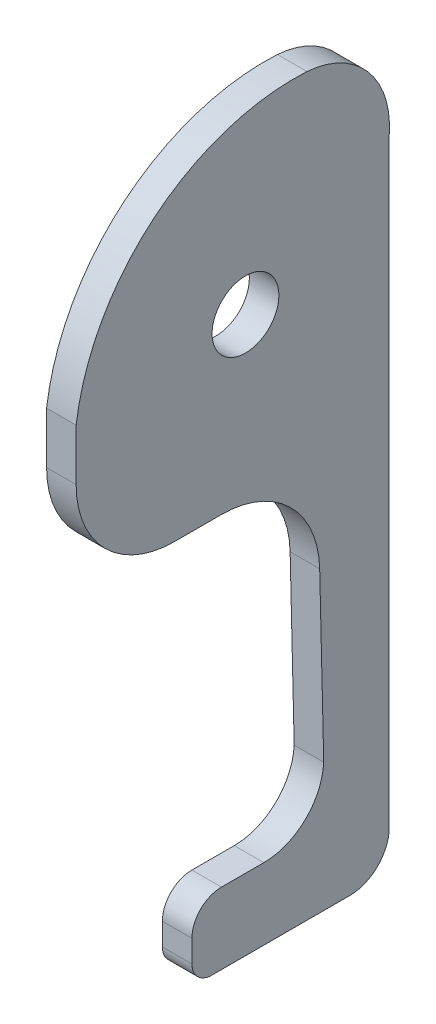
ISO-10303-21;
HEADER;
FILE_DESCRIPTION(('STEP AP214'),'2;1');
FILE_NAME('part.step','',(''),(''),'','','');
FILE_SCHEMA(('AUTOMOTIVE_DESIGN { 1 0 10303 214 1 1 1 1 }'));
ENDSEC;
DATA;
#1=APPLICATION_CONTEXT('core data for automotive mechanical design processes');
#2=APPLICATION_PROTOCOL_DEFINITION('international standard','automotive_design',2000,#1);
#3=PRODUCT_CONTEXT('',#1,'mechanical');
#4=PRODUCT('Part','Part','',(#3));
#5=PRODUCT_RELATED_PRODUCT_CATEGORY('part','',(#4));
#6=PRODUCT_DEFINITION_FORMATION('','',#4);
#7=PRODUCT_DEFINITION_CONTEXT('part definition',#1,'design');
#8=PRODUCT_DEFINITION('design','',#6,#7);
#9=PRODUCT_DEFINITION_SHAPE('','',#8);
#10=(LENGTH_UNIT() NAMED_UNIT(*) SI_UNIT(.MILLI.,.METRE.));
#11=(NAMED_UNIT(*) PLANE_ANGLE_UNIT() SI_UNIT($,.RADIAN.));
#12=(NAMED_UNIT(*) SI_UNIT($,.STERADIAN.) SOLID_ANGLE_UNIT());
#13=UNCERTAINTY_MEASURE_WITH_UNIT(LENGTH_MEASURE(1.E-05),#10,'distance_accuracy_value','');
#14=(GEOMETRIC_REPRESENTATION_CONTEXT(3) GLOBAL_UNCERTAINTY_ASSIGNED_CONTEXT((#13)) GLOBAL_UNIT_ASSIGNED_CONTEXT((#10,
#11,#12)) REPRESENTATION_CONTEXT('',''));
#15=CARTESIAN_POINT('',(0.,0.,0.));
#16=DIRECTION('',(0.,0.,1.));
#17=DIRECTION('',(1.,0.,0.));
#18=AXIS2_PLACEMENT_3D('',#15,#16,#17);
#19=CARTESIAN_POINT('',(8.6051080575,-142.638124585522,-103.998404298556));
#20=DIRECTION('',(-1.,0.,0.));
#21=DIRECTION('',(0.,0.,1.));
#22=AXIS2_PLACEMENT_3D('',#19,#20,#21);
#23=CYLINDRICAL_SURFACE('',#22,2.94695482);
#24=CARTESIAN_POINT('',(6.3948919425,-142.638124585522,-103.998404298556));
#25=DIRECTION('',(-1.,0.,0.));
#26=DIRECTION('',(0.,0.,1.));
#27=AXIS2_PLACEMENT_3D('',#24,#25,#26);
#28=CIRCLE('',#27,2.94695482);
#29=CARTESIAN_POINT('',(6.3948919425,-142.638124585522,-106.945359118556));
#30=VERTEX_POINT('',#29);
#31=CARTESIAN_POINT('',(6.3948919425,-145.585079405522,-103.998404298556));
#32=VERTEX_POINT('',#31);
#33=EDGE_CURVE('E233',#30,#32,#28,.T.);
#34=ORIENTED_EDGE('',*,*,#33,.F.);
#35=DIRECTION('',(-1.,0.,0.));
#36=VECTOR('',#35,1.);
#37=CARTESIAN_POINT('',(8.6051080575,-142.638124585522,-106.945359118556));
#38=LINE('',#37,#36);
#39=CARTESIAN_POINT('',(8.6051080575,-142.638124585522,-106.945359118556));
#40=VERTEX_POINT('',#39);
#41=EDGE_CURVE('E51',#40,#30,#38,.T.);
#42=ORIENTED_EDGE('',*,*,#41,.F.);
#43=CARTESIAN_POINT('',(8.6051080575,-142.638124585522,-103.998404298556));
#44=DIRECTION('',(-1.,0.,0.));
#45=DIRECTION('',(0.,0.,1.));
#46=AXIS2_PLACEMENT_3D('',#43,#44,#45);
#47=CIRCLE('',#46,2.94695482);
#48=CARTESIAN_POINT('',(8.6051080575,-145.585079405522,-103.998404298556));
#49=VERTEX_POINT('',#48);
#50=EDGE_CURVE('E169',#40,#49,#47,.T.);
#51=ORIENTED_EDGE('',*,*,#50,.T.);
#52=DIRECTION('',(-1.,0.,0.));
#53=VECTOR('',#52,1.);
#54=CARTESIAN_POINT('',(8.6051080575,-145.585079405522,-103.998404298556));
#55=LINE('',#54,#53);
#56=EDGE_CURVE('E11',#49,#32,#55,.T.);
#57=ORIENTED_EDGE('',*,*,#56,.T.);
#58=EDGE_LOOP('',(#34,#42,#51,#57));
#59=FACE_BOUND('',#58,.T.);
#60=ADVANCED_FACE('F40',(#59),#23,.T.);
#61=CARTESIAN_POINT('',(8.6051080575,-117.576390359599,-106.945359118556));
#62=DIRECTION('',(0.,0.,-1.));
#63=DIRECTION('',(0.,1.,0.));
#64=AXIS2_PLACEMENT_3D('',#61,#62,#63);
#65=PLANE('',#64);
#66=DIRECTION('',(0.,-1.,0.));
#67=VECTOR('',#66,1.);
#68=CARTESIAN_POINT('',(6.3948919425,-117.576390359599,-106.945359118556));
#69=LINE('',#68,#67);
#70=CARTESIAN_POINT('',(6.3948919425,-97.7279960641527,-106.945359118556));
#71=VERTEX_POINT('',#70);
#72=EDGE_CURVE('E153',#71,#30,#69,.T.);
#73=ORIENTED_EDGE('',*,*,#72,.F.);
#74=DIRECTION('',(-1.,0.,0.));
#75=VECTOR('',#74,1.);
#76=CARTESIAN_POINT('',(8.6051080575,-97.7279960641527,-106.945359118556));
#77=LINE('',#76,#75);
#78=CARTESIAN_POINT('',(8.6051080575,-97.7279960641527,-106.945359118556));
#79=VERTEX_POINT('',#78);
#80=EDGE_CURVE('E149',#79,#71,#77,.T.);
#81=ORIENTED_EDGE('',*,*,#80,.F.);
#82=DIRECTION('',(0.,-1.,0.));
#83=VECTOR('',#82,1.);
#84=CARTESIAN_POINT('',(8.6051080575,-97.7279960641527,-106.945359118556));
#85=LINE('',#84,#83);
#86=EDGE_CURVE('E152',#79,#40,#85,.T.);
#87=ORIENTED_EDGE('',*,*,#86,.T.);
#88=ORIENTED_EDGE('',*,*,#41,.T.);
#89=EDGE_LOOP('',(#73,#81,#87,#88));
#90=FACE_BOUND('',#89,.T.);
#91=ADVANCED_FACE('F151',(#90),#65,.T.);
#92=CARTESIAN_POINT('',(8.6051080575,-97.2470368833061,-100.307779911894));
#93=DIRECTION('',(-1.,0.,0.));
#94=DIRECTION('',(0.,0.,1.));
#95=AXIS2_PLACEMENT_3D('',#92,#93,#94);
#96=CYLINDRICAL_SURFACE('',#95,6.65498155206749);
#97=CARTESIAN_POINT('',(6.3948919425,-97.2470368833061,-100.307779911894));
#98=DIRECTION('',(-1.,0.,0.));
#99=DIRECTION('',(0.,0.,1.));
#100=AXIS2_PLACEMENT_3D('',#97,#98,#99);
#101=CIRCLE('',#100,6.65498155206749);
#102=CARTESIAN_POINT('',(6.3948919425,-90.609457678078,-100.788739112537));
#103=VERTEX_POINT('',#102);
#104=EDGE_CURVE('E228',#103,#71,#101,.T.);
#105=ORIENTED_EDGE('',*,*,#104,.F.);
#106=DIRECTION('',(-1.,0.,0.));
#107=VECTOR('',#106,1.);
#108=CARTESIAN_POINT('',(8.6051080575,-90.609457678078,-100.788739112537));
#109=LINE('',#108,#107);
#110=CARTESIAN_POINT('',(8.6051080575,-90.609457678078,-100.788739112537));
#111=VERTEX_POINT('',#110);
#112=EDGE_CURVE('E159',#111,#103,#109,.T.);
#113=ORIENTED_EDGE('',*,*,#112,.F.);
#114=CARTESIAN_POINT('',(8.6051080575,-97.2470368833061,-100.307779911894));
#115=DIRECTION('',(-1.,0.,0.));
#116=DIRECTION('',(0.,0.,1.));
#117=AXIS2_PLACEMENT_3D('',#114,#115,#116);
#118=CIRCLE('',#117,6.65498155206749);
#119=EDGE_CURVE('E166',#111,#79,#118,.T.);
#120=ORIENTED_EDGE('',*,*,#119,.T.);
#121=ORIENTED_EDGE('',*,*,#80,.T.);
#122=EDGE_LOOP('',(#105,#113,#120,#121));
#123=FACE_BOUND('',#122,.T.);
#124=ADVANCED_FACE('F172',(#123),#96,.T.);
#125=CARTESIAN_POINT('',(8.6051080575,-107.066434118897,-99.8630237145166));
#126=DIRECTION('',(-1.,0.,0.));
#127=DIRECTION('',(0.,0.,1.));
#128=AXIS2_PLACEMENT_3D('',#125,#126,#127);
#129=CYLINDRICAL_SURFACE('',#128,16.4829919180898);
#130=CARTESIAN_POINT('',(6.3948919425,-107.066434118897,-99.8630237145166));
#131=DIRECTION('',(-1.,0.,0.));
#132=DIRECTION('',(0.,0.,1.));
#133=AXIS2_PLACEMENT_3D('',#130,#131,#132);
#134=CIRCLE('',#133,16.4829919180898);
#135=CARTESIAN_POINT('',(6.3948919425,-104.877257467146,-83.5260555698687));
#136=VERTEX_POINT('',#135);
#137=EDGE_CURVE('E224',#136,#103,#134,.T.);
#138=ORIENTED_EDGE('',*,*,#137,.F.);
#139=DIRECTION('',(-1.,0.,0.));
#140=VECTOR('',#139,1.);
#141=CARTESIAN_POINT('',(8.6051080575,-104.877257467146,-83.5260555698687));
#142=LINE('',#141,#140);
#143=CARTESIAN_POINT('',(8.6051080575,-104.877257467146,-83.5260555698687));
#144=VERTEX_POINT('',#143);
#145=EDGE_CURVE('E241',#144,#136,#142,.T.);
#146=ORIENTED_EDGE('',*,*,#145,.F.);
#147=CARTESIAN_POINT('',(8.6051080575,-107.066434118897,-99.8630237145166));
#148=DIRECTION('',(-1.,0.,0.));
#149=DIRECTION('',(0.,0.,1.));
#150=AXIS2_PLACEMENT_3D('',#147,#148,#149);
#151=CIRCLE('',#150,16.4829919180898);
#152=EDGE_CURVE('E174',#144,#111,#151,.T.);
#153=ORIENTED_EDGE('',*,*,#152,.T.);
#154=ORIENTED_EDGE('',*,*,#112,.T.);
#155=EDGE_LOOP('',(#138,#146,#153,#154));
#156=FACE_BOUND('',#155,.T.);
#157=ADVANCED_FACE('F293',(#156),#129,.T.);
#158=CARTESIAN_POINT('',(8.6051080575,-104.877257467146,-83.5260555698687));
#159=DIRECTION('',(0.,0.,-1.));
#160=DIRECTION('',(0.,1.,0.));
#161=AXIS2_PLACEMENT_3D('',#158,#159,#160);
#162=PLANE('',#161);
#163=DIRECTION('',(0.,-1.,0.));
#164=VECTOR('',#163,1.);
#165=CARTESIAN_POINT('',(6.3948919425,-104.877257467146,-83.5260555698687));
#166=LINE('',#165,#164);
#167=CARTESIAN_POINT('',(6.3948919425,-108.735525899599,-83.5260555698687));
#168=VERTEX_POINT('',#167);
#169=EDGE_CURVE('E221',#136,#168,#166,.T.);
#170=ORIENTED_EDGE('',*,*,#169,.T.);
#171=DIRECTION('',(-1.,0.,0.));
#172=VECTOR('',#171,1.);
#173=CARTESIAN_POINT('',(8.6051080575,-108.735525899599,-83.5260555698687));
#174=LINE('',#173,#172);
#175=CARTESIAN_POINT('',(8.6051080575,-108.735525899599,-83.5260555698687));
#176=VERTEX_POINT('',#175);
#177=EDGE_CURVE('E244',#176,#168,#174,.T.);
#178=ORIENTED_EDGE('',*,*,#177,.F.);
#179=DIRECTION('',(0.,-1.,0.));
#180=VECTOR('',#179,1.);
#181=CARTESIAN_POINT('',(8.6051080575,-104.877257467146,-83.5260555698687));
#182=LINE('',#181,#180);
#183=EDGE_CURVE('E177',#144,#176,#182,.T.);
#184=ORIENTED_EDGE('',*,*,#183,.F.);
#185=ORIENTED_EDGE('',*,*,#145,.T.);
#186=EDGE_LOOP('',(#170,#178,#184,#185));
#187=FACE_BOUND('',#186,.T.);
#188=ADVANCED_FACE('F296',(#187),#162,.F.);
#189=CARTESIAN_POINT('',(8.6051080575,-108.735525899599,-90.8934426198687));
#190=DIRECTION('',(-1.,0.,0.));
#191=DIRECTION('',(0.,0.,1.));
#192=AXIS2_PLACEMENT_3D('',#189,#190,#191);
#193=CYLINDRICAL_SURFACE('',#192,7.36738705);
#194=CARTESIAN_POINT('',(6.3948919425,-108.735525899599,-90.8934426198687));
#195=DIRECTION('',(1.,0.,0.));
#196=DIRECTION('',(0.,0.,-1.));
#197=AXIS2_PLACEMENT_3D('',#194,#195,#196);
#198=CIRCLE('',#197,7.36738705);
#199=CARTESIAN_POINT('',(6.3948919425,-116.102912949599,-90.8934426198687));
#200=VERTEX_POINT('',#199);
#201=EDGE_CURVE('E218',#168,#200,#198,.T.);
#202=ORIENTED_EDGE('',*,*,#201,.T.);
#203=DIRECTION('',(-1.,0.,0.));
#204=VECTOR('',#203,1.);
#205=CARTESIAN_POINT('',(8.6051080575,-116.102912949599,-90.8934426198687));
#206=LINE('',#205,#204);
#207=CARTESIAN_POINT('',(8.6051080575,-116.102912949599,-90.8934426198687));
#208=VERTEX_POINT('',#207);
#209=EDGE_CURVE('E248',#208,#200,#206,.T.);
#210=ORIENTED_EDGE('',*,*,#209,.F.);
#211=CARTESIAN_POINT('',(8.6051080575,-108.735525899599,-90.8934426198687));
#212=DIRECTION('',(1.,0.,0.));
#213=DIRECTION('',(0.,0.,-1.));
#214=AXIS2_PLACEMENT_3D('',#211,#212,#213);
#215=CIRCLE('',#214,7.36738705);
#216=EDGE_CURVE('E392',#176,#208,#215,.T.);
#217=ORIENTED_EDGE('',*,*,#216,.F.);
#218=ORIENTED_EDGE('',*,*,#177,.T.);
#219=EDGE_LOOP('',(#202,#210,#217,#218));
#220=FACE_BOUND('',#219,.T.);
#221=ADVANCED_FACE('F300',(#220),#193,.T.);
#222=CARTESIAN_POINT('',(8.6051080575,-116.102912949599,-90.8934426198687));
#223=DIRECTION('',(0.,1.,0.));
#224=DIRECTION('',(0.,0.,1.));
#225=AXIS2_PLACEMENT_3D('',#222,#223,#224);
#226=PLANE('',#225);
#227=DIRECTION('',(0.,0.,-1.));
#228=VECTOR('',#227,1.);
#229=CARTESIAN_POINT('',(6.3948919425,-116.102912949599,-90.8934426198687));
#230=LINE('',#229,#228);
#231=CARTESIAN_POINT('',(6.3948919425,-116.102912949599,-94.3771718957853));
#232=VERTEX_POINT('',#231);
#233=EDGE_CURVE('E214',#200,#232,#230,.T.);
#234=ORIENTED_EDGE('',*,*,#233,.T.);
#235=DIRECTION('',(-1.,0.,0.));
#236=VECTOR('',#235,1.);
#237=CARTESIAN_POINT('',(8.6051080575,-116.102912949599,-94.3771718957853));
#238=LINE('',#237,#236);
#239=CARTESIAN_POINT('',(8.6051080575,-116.102912949599,-94.3771718957853));
#240=VERTEX_POINT('',#239);
#241=EDGE_CURVE('E252',#240,#232,#238,.T.);
#242=ORIENTED_EDGE('',*,*,#241,.F.);
#243=DIRECTION('',(0.,0.,-1.));
#244=VECTOR('',#243,1.);
#245=CARTESIAN_POINT('',(8.6051080575,-116.102912949599,-90.8934426198687));
#246=LINE('',#245,#244);
#247=EDGE_CURVE('E389',#208,#240,#246,.T.);
#248=ORIENTED_EDGE('',*,*,#247,.F.);
#249=ORIENTED_EDGE('',*,*,#209,.T.);
#250=EDGE_LOOP('',(#234,#242,#248,#249));
#251=FACE_BOUND('',#250,.T.);
#252=ADVANCED_FACE('F304',(#251),#226,.F.);
#253=CARTESIAN_POINT('',(8.6051080575,-123.470299999599,-94.3771718957853));
#254=DIRECTION('',(-1.,0.,0.));
#255=DIRECTION('',(0.,0.,1.));
#256=AXIS2_PLACEMENT_3D('',#253,#254,#255);
#257=CYLINDRICAL_SURFACE('',#256,7.36738705);
#258=CARTESIAN_POINT('',(6.3948919425,-123.470299999599,-94.3771718957853));
#259=DIRECTION('',(1.,0.,0.));
#260=DIRECTION('',(0.,0.,-1.));
#261=AXIS2_PLACEMENT_3D('',#258,#259,#260);
#262=CIRCLE('',#261,7.36738705);
#263=CARTESIAN_POINT('',(6.3948919425,-123.294437875062,-101.742459701273));
#264=VERTEX_POINT('',#263);
#265=EDGE_CURVE('E210',#264,#232,#262,.T.);
#266=ORIENTED_EDGE('',*,*,#265,.F.);
#267=DIRECTION('',(-1.,0.,0.));
#268=VECTOR('',#267,1.);
#269=CARTESIAN_POINT('',(8.6051080575,-123.294437875062,-101.742459701273));
#270=LINE('',#269,#268);
#271=CARTESIAN_POINT('',(8.6051080575,-123.294437875062,-101.742459701273));
#272=VERTEX_POINT('',#271);
#273=EDGE_CURVE('E255',#272,#264,#270,.T.);
#274=ORIENTED_EDGE('',*,*,#273,.F.);
#275=CARTESIAN_POINT('',(8.6051080575,-123.470299999599,-94.3771718957853));
#276=DIRECTION('',(1.,0.,0.));
#277=DIRECTION('',(0.,0.,-1.));
#278=AXIS2_PLACEMENT_3D('',#275,#276,#277);
#279=CIRCLE('',#278,7.36738705);
#280=EDGE_CURVE('E385',#272,#240,#279,.T.);
#281=ORIENTED_EDGE('',*,*,#280,.T.);
#282=ORIENTED_EDGE('',*,*,#241,.T.);
#283=EDGE_LOOP('',(#266,#274,#281,#282));
#284=FACE_BOUND('',#283,.T.);
#285=ADVANCED_FACE('F308',(#284),#257,.F.);
#286=CARTESIAN_POINT('',(8.6051080575,-123.294437875062,-101.742459701273));
#287=DIRECTION('',(0.,0.0238703523167288,-0.999715062545461));
#288=DIRECTION('',(0.,0.999715062545461,0.0238703523167288));
#289=AXIS2_PLACEMENT_3D('',#286,#287,#288);
#290=PLANE('',#289);
#291=DIRECTION('',(0.,-0.999715062545461,-0.0238703523167288));
#292=VECTOR('',#291,1.);
#293=CARTESIAN_POINT('',(6.3948919425,-123.294437875062,-101.742459701273));
#294=LINE('',#293,#292);
#295=CARTESIAN_POINT('',(6.3948919425,-135.973161881235,-102.045191569875));
#296=VERTEX_POINT('',#295);
#297=EDGE_CURVE('E206',#264,#296,#294,.T.);
#298=ORIENTED_EDGE('',*,*,#297,.T.);
#299=DIRECTION('',(-1.,0.,0.));
#300=VECTOR('',#299,1.);
#301=CARTESIAN_POINT('',(8.6051080575,-135.973161881235,-102.045191569875));
#302=LINE('',#301,#300);
#303=CARTESIAN_POINT('',(8.6051080575,-135.973161881235,-102.045191569875));
#304=VERTEX_POINT('',#303);
#305=EDGE_CURVE('E258',#304,#296,#302,.T.);
#306=ORIENTED_EDGE('',*,*,#305,.F.);
#307=DIRECTION('',(0.,-0.999715062545461,-0.0238703523167288));
#308=VECTOR('',#307,1.);
#309=CARTESIAN_POINT('',(8.6051080575,-123.294437875062,-101.742459701273));
#310=LINE('',#309,#308);
#311=EDGE_CURVE('E382',#272,#304,#310,.T.);
#312=ORIENTED_EDGE('',*,*,#311,.F.);
#313=ORIENTED_EDGE('',*,*,#273,.T.);
#314=EDGE_LOOP('',(#298,#306,#312,#313));
#315=FACE_BOUND('',#314,.T.);
#316=ADVANCED_FACE('F312',(#315),#290,.F.);
#317=CARTESIAN_POINT('',(8.6051080575,-135.756130944168,-97.5675849806097));
#318=DIRECTION('',(-1.,0.,0.));
#319=DIRECTION('',(0.,0.,1.));
#320=AXIS2_PLACEMENT_3D('',#317,#318,#319);
#321=CYLINDRICAL_SURFACE('',#320,4.48286328097044);
#322=CARTESIAN_POINT('',(6.3948919425,-135.756130944168,-97.5675849806097));
#323=DIRECTION('',(1.,0.,0.));
#324=DIRECTION('',(0.,0.,-1.));
#325=AXIS2_PLACEMENT_3D('',#322,#323,#324);
#326=CIRCLE('',#325,4.48286328097044);
#327=CARTESIAN_POINT('',(6.3948919425,-140.238994225138,-97.5675849806097));
#328=VERTEX_POINT('',#327);
#329=EDGE_CURVE('E202',#328,#296,#326,.T.);
#330=ORIENTED_EDGE('',*,*,#329,.F.);
#331=DIRECTION('',(-1.,0.,0.));
#332=VECTOR('',#331,1.);
#333=CARTESIAN_POINT('',(8.6051080575,-140.238994225138,-97.5675849806097));
#334=LINE('',#333,#332);
#335=CARTESIAN_POINT('',(8.6051080575,-140.238994225138,-97.5675849806097));
#336=VERTEX_POINT('',#335);
#337=EDGE_CURVE('E261',#336,#328,#334,.T.);
#338=ORIENTED_EDGE('',*,*,#337,.F.);
#339=CARTESIAN_POINT('',(8.6051080575,-135.756130944168,-97.5675849806097));
#340=DIRECTION('',(1.,0.,0.));
#341=DIRECTION('',(0.,0.,-1.));
#342=AXIS2_PLACEMENT_3D('',#339,#340,#341);
#343=CIRCLE('',#342,4.48286328097044);
#344=EDGE_CURVE('E378',#336,#304,#343,.T.);
#345=ORIENTED_EDGE('',*,*,#344,.T.);
#346=ORIENTED_EDGE('',*,*,#305,.T.);
#347=EDGE_LOOP('',(#330,#338,#345,#346));
#348=FACE_BOUND('',#347,.T.);
#349=ADVANCED_FACE('F316',(#348),#321,.F.);
#350=CARTESIAN_POINT('',(8.6051080575,-140.238994225138,-97.5675849806097));
#351=DIRECTION('',(0.,-1.,0.));
#352=DIRECTION('',(0.,0.,-1.));
#353=AXIS2_PLACEMENT_3D('',#350,#351,#352);
#354=PLANE('',#353);
#355=DIRECTION('',(0.,0.,1.));
#356=VECTOR('',#355,1.);
#357=CARTESIAN_POINT('',(6.3948919425,-140.238994225138,-97.5675849806097));
#358=LINE('',#357,#356);
#359=CARTESIAN_POINT('',(6.3948919425,-140.238994225138,-94.3967372935758));
#360=VERTEX_POINT('',#359);
#361=EDGE_CURVE('E198',#328,#360,#358,.T.);
#362=ORIENTED_EDGE('',*,*,#361,.T.);
#363=DIRECTION('',(-1.,0.,0.));
#364=VECTOR('',#363,1.);
#365=CARTESIAN_POINT('',(8.6051080575,-140.238994225138,-94.3967372935758));
#366=LINE('',#365,#364);
#367=CARTESIAN_POINT('',(8.6051080575,-140.238994225138,-94.3967372935758));
#368=VERTEX_POINT('',#367);
#369=EDGE_CURVE('E264',#368,#360,#366,.T.);
#370=ORIENTED_EDGE('',*,*,#369,.F.);
#371=DIRECTION('',(0.,0.,1.));
#372=VECTOR('',#371,1.);
#373=CARTESIAN_POINT('',(8.6051080575,-140.238994225138,-97.5675849806097));
#374=LINE('',#373,#372);
#375=EDGE_CURVE('E375',#336,#368,#374,.T.);
#376=ORIENTED_EDGE('',*,*,#375,.F.);
#377=ORIENTED_EDGE('',*,*,#337,.T.);
#378=EDGE_LOOP('',(#362,#370,#376,#377));
#379=FACE_BOUND('',#378,.T.);
#380=ADVANCED_FACE('F320',(#379),#354,.F.);
#381=CARTESIAN_POINT('',(8.6051080575,-142.449210340138,-94.3967372935758));
#382=DIRECTION('',(-1.,0.,0.));
#383=DIRECTION('',(0.,0.,1.));
#384=AXIS2_PLACEMENT_3D('',#381,#382,#383);
#385=CYLINDRICAL_SURFACE('',#384,2.210216115);
#386=CARTESIAN_POINT('',(6.3948919425,-142.449210340138,-94.3967372935758));
#387=DIRECTION('',(-1.,0.,0.));
#388=DIRECTION('',(0.,0.,1.));
#389=AXIS2_PLACEMENT_3D('',#386,#387,#388);
#390=CIRCLE('',#389,2.210216115);
#391=CARTESIAN_POINT('',(6.3948919425,-142.449210340138,-92.1865211785758));
#392=VERTEX_POINT('',#391);
#393=EDGE_CURVE('E194',#392,#360,#390,.T.);
#394=ORIENTED_EDGE('',*,*,#393,.F.);
#395=DIRECTION('',(-1.,0.,0.));
#396=VECTOR('',#395,1.);
#397=CARTESIAN_POINT('',(8.6051080575,-142.449210340138,-92.1865211785758));
#398=LINE('',#397,#396);
#399=CARTESIAN_POINT('',(8.6051080575,-142.449210340138,-92.1865211785758));
#400=VERTEX_POINT('',#399);
#401=EDGE_CURVE('E267',#400,#392,#398,.T.);
#402=ORIENTED_EDGE('',*,*,#401,.F.);
#403=CARTESIAN_POINT('',(8.6051080575,-142.449210340138,-94.3967372935758));
#404=DIRECTION('',(-1.,0.,0.));
#405=DIRECTION('',(0.,0.,1.));
#406=AXIS2_PLACEMENT_3D('',#403,#404,#405);
#407=CIRCLE('',#406,2.210216115);
#408=EDGE_CURVE('E371',#400,#368,#407,.T.);
#409=ORIENTED_EDGE('',*,*,#408,.T.);
#410=ORIENTED_EDGE('',*,*,#369,.T.);
#411=EDGE_LOOP('',(#394,#402,#409,#410));
#412=FACE_BOUND('',#411,.T.);
#413=ADVANCED_FACE('F324',(#412),#385,.T.);
#414=CARTESIAN_POINT('',(8.6051080575,-144.111601995522,-92.1865211785758));
#415=DIRECTION('',(0.,0.,1.));
#416=DIRECTION('',(0.,-1.,0.));
#417=AXIS2_PLACEMENT_3D('',#414,#415,#416);
#418=PLANE('',#417);
#419=DIRECTION('',(0.,1.,0.));
#420=VECTOR('',#419,1.);
#421=CARTESIAN_POINT('',(6.3948919425,-144.111601995522,-92.1865211785758));
#422=LINE('',#421,#420);
#423=CARTESIAN_POINT('',(6.3948919425,-144.111601995522,-92.1865211785758));
#424=VERTEX_POINT('',#423);
#425=EDGE_CURVE('E190',#424,#392,#422,.T.);
#426=ORIENTED_EDGE('',*,*,#425,.F.);
#427=DIRECTION('',(-1.,0.,0.));
#428=VECTOR('',#427,1.);
#429=CARTESIAN_POINT('',(8.6051080575,-144.111601995522,-92.1865211785758));
#430=LINE('',#429,#428);
#431=CARTESIAN_POINT('',(8.6051080575,-144.111601995522,-92.1865211785758));
#432=VERTEX_POINT('',#431);
#433=EDGE_CURVE('E269',#432,#424,#430,.T.);
#434=ORIENTED_EDGE('',*,*,#433,.F.);
#435=DIRECTION('',(0.,1.,0.));
#436=VECTOR('',#435,1.);
#437=CARTESIAN_POINT('',(8.6051080575,-144.111601995522,-92.1865211785758));
#438=LINE('',#437,#436);
#439=EDGE_CURVE('E367',#432,#400,#438,.T.);
#440=ORIENTED_EDGE('',*,*,#439,.T.);
#441=ORIENTED_EDGE('',*,*,#401,.T.);
#442=EDGE_LOOP('',(#426,#434,#440,#441));
#443=FACE_BOUND('',#442,.T.);
#444=ADVANCED_FACE('F328',(#443),#418,.T.);
#445=CARTESIAN_POINT('',(8.6051080575,-144.111601995522,-93.6599985885758));
#446=DIRECTION('',(-1.,0.,0.));
#447=DIRECTION('',(0.,0.,1.));
#448=AXIS2_PLACEMENT_3D('',#445,#446,#447);
#449=CYLINDRICAL_SURFACE('',#448,1.47347741);
#450=CARTESIAN_POINT('',(6.3948919425,-144.111601995522,-93.6599985885758));
#451=DIRECTION('',(1.,0.,0.));
#452=DIRECTION('',(0.,0.,-1.));
#453=AXIS2_PLACEMENT_3D('',#450,#451,#452);
#454=CIRCLE('',#453,1.47347741);
#455=CARTESIAN_POINT('',(6.3948919425,-145.585079405522,-93.6599985885758));
#456=VERTEX_POINT('',#455);
#457=EDGE_CURVE('E185',#424,#456,#454,.T.);
#458=ORIENTED_EDGE('',*,*,#457,.T.);
#459=DIRECTION('',(-1.,0.,0.));
#460=VECTOR('',#459,1.);
#461=CARTESIAN_POINT('',(8.6051080575,-145.585079405522,-93.6599985885758));
#462=LINE('',#461,#460);
#463=CARTESIAN_POINT('',(8.6051080575,-145.585079405522,-93.6599985885758));
#464=VERTEX_POINT('',#463);
#465=EDGE_CURVE('E44',#464,#456,#462,.T.);
#466=ORIENTED_EDGE('',*,*,#465,.F.);
#467=CARTESIAN_POINT('',(8.6051080575,-144.111601995522,-93.6599985885758));
#468=DIRECTION('',(1.,0.,0.));
#469=DIRECTION('',(0.,0.,-1.));
#470=AXIS2_PLACEMENT_3D('',#467,#468,#469);
#471=CIRCLE('',#470,1.47347741);
#472=EDGE_CURVE('E364',#432,#464,#471,.T.);
#473=ORIENTED_EDGE('',*,*,#472,.F.);
#474=ORIENTED_EDGE('',*,*,#433,.T.);
#475=EDGE_LOOP('',(#458,#466,#473,#474));
#476=FACE_BOUND('',#475,.T.);
#477=ADVANCED_FACE('F276',(#476),#449,.T.);
#478=CARTESIAN_POINT('',(8.6051080575,-145.585079405522,-100.804429599669));
#479=DIRECTION('',(0.,-1.,0.));
#480=DIRECTION('',(0.,0.,-1.));
#481=AXIS2_PLACEMENT_3D('',#478,#479,#480);
#482=PLANE('',#481);
#483=DIRECTION('',(0.,0.,1.));
#484=VECTOR('',#483,1.);
#485=CARTESIAN_POINT('',(6.3948919425,-145.585079405522,-100.804429599669));
#486=LINE('',#485,#484);
#487=EDGE_CURVE('E110',#32,#456,#486,.T.);
#488=ORIENTED_EDGE('',*,*,#487,.F.);
#489=ORIENTED_EDGE('',*,*,#56,.F.);
#490=DIRECTION('',(0.,0.,1.));
#491=VECTOR('',#490,1.);
#492=CARTESIAN_POINT('',(8.6051080575,-145.585079405522,-103.998404298556));
#493=LINE('',#492,#491);
#494=EDGE_CURVE('E113',#49,#464,#493,.T.);
#495=ORIENTED_EDGE('',*,*,#494,.T.);
#496=ORIENTED_EDGE('',*,*,#465,.T.);
#497=EDGE_LOOP('',(#488,#489,#495,#496));
#498=FACE_BOUND('',#497,.T.);
#499=ADVANCED_FACE('F42',(#498),#482,.T.);
#500=CARTESIAN_POINT('',(8.6051080575,-144.111601995522,-93.6599985885758));
#501=DIRECTION('',(1.,0.,0.));
#502=DIRECTION('',(0.,0.,-1.));
#503=AXIS2_PLACEMENT_3D('',#500,#501,#502);
#504=PLANE('',#503);
#505=CARTESIAN_POINT('',(8.6051080575,-104.044147658078,-96.1920545685564));
#506=DIRECTION('',(1.,0.,0.));
#507=DIRECTION('',(0.,0.,-1.));
#508=AXIS2_PLACEMENT_3D('',#505,#506,#507);
#509=CIRCLE('',#508,2.5);
#510=CARTESIAN_POINT('',(8.6051080575,-104.044147658078,-98.6920545685564));
#511=VERTEX_POINT('',#510);
#512=EDGE_CURVE('E354',#511,#511,#509,.T.);
#513=ORIENTED_EDGE('',*,*,#512,.F.);
#514=EDGE_LOOP('',(#513));
#515=FACE_BOUND('',#514,.T.);
#516=ORIENTED_EDGE('',*,*,#494,.F.);
#517=ORIENTED_EDGE('',*,*,#50,.F.);
#518=ORIENTED_EDGE('',*,*,#86,.F.);
#519=ORIENTED_EDGE('',*,*,#119,.F.);
#520=ORIENTED_EDGE('',*,*,#152,.F.);
#521=ORIENTED_EDGE('',*,*,#183,.T.);
#522=ORIENTED_EDGE('',*,*,#216,.T.);
#523=ORIENTED_EDGE('',*,*,#247,.T.);
#524=ORIENTED_EDGE('',*,*,#280,.F.);
#525=ORIENTED_EDGE('',*,*,#311,.T.);
#526=ORIENTED_EDGE('',*,*,#344,.F.);
#527=ORIENTED_EDGE('',*,*,#375,.T.);
#528=ORIENTED_EDGE('',*,*,#408,.F.);
#529=ORIENTED_EDGE('',*,*,#439,.F.);
#530=ORIENTED_EDGE('',*,*,#472,.T.);
#531=EDGE_LOOP('',(#516,#517,#518,#519,#520,#521,#522,#523,#524,#525,#526,#527,#528,#529,#530));
#532=FACE_BOUND('',#531,.T.);
#533=ADVANCED_FACE('F164',(#515,#532),#504,.T.);
#534=CARTESIAN_POINT('',(6.3948919425,-144.111601995522,-93.6599985885758));
#535=DIRECTION('',(1.,0.,0.));
#536=DIRECTION('',(0.,0.,-1.));
#537=AXIS2_PLACEMENT_3D('',#534,#535,#536);
#538=PLANE('',#537);
#539=CARTESIAN_POINT('',(6.3948919425,-104.044147658078,-96.1920545685564));
#540=DIRECTION('',(1.,0.,0.));
#541=DIRECTION('',(0.,0.,-1.));
#542=AXIS2_PLACEMENT_3D('',#539,#540,#541);
#543=CIRCLE('',#542,2.5);
#544=CARTESIAN_POINT('',(6.3948919425,-104.044147658078,-98.6920545685564));
#545=VERTEX_POINT('',#544);
#546=EDGE_CURVE('E186',#545,#545,#543,.F.);
#547=ORIENTED_EDGE('',*,*,#546,.F.);
#548=EDGE_LOOP('',(#547));
#549=FACE_BOUND('',#548,.T.);
#550=ORIENTED_EDGE('',*,*,#33,.T.);
#551=ORIENTED_EDGE('',*,*,#487,.T.);
#552=ORIENTED_EDGE('',*,*,#457,.F.);
#553=ORIENTED_EDGE('',*,*,#425,.T.);
#554=ORIENTED_EDGE('',*,*,#393,.T.);
#555=ORIENTED_EDGE('',*,*,#361,.F.);
#556=ORIENTED_EDGE('',*,*,#329,.T.);
#557=ORIENTED_EDGE('',*,*,#297,.F.);
#558=ORIENTED_EDGE('',*,*,#265,.T.);
#559=ORIENTED_EDGE('',*,*,#233,.F.);
#560=ORIENTED_EDGE('',*,*,#201,.F.);
#561=ORIENTED_EDGE('',*,*,#169,.F.);
#562=ORIENTED_EDGE('',*,*,#137,.T.);
#563=ORIENTED_EDGE('',*,*,#104,.T.);
#564=ORIENTED_EDGE('',*,*,#72,.T.);
#565=EDGE_LOOP('',(#550,#551,#552,#553,#554,#555,#556,#557,#558,#559,#560,#561,#562,#563,#564));
#566=FACE_BOUND('',#565,.T.);
#567=ADVANCED_FACE('F279',(#549,#566),#538,.F.);
#568=CARTESIAN_POINT('',(6.3938919425,-104.044147658078,-96.1920545685564));
#569=DIRECTION('',(1.,0.,0.));
#570=DIRECTION('',(0.,0.,-1.));
#571=AXIS2_PLACEMENT_3D('',#568,#569,#570);
#572=CYLINDRICAL_SURFACE('',#571,2.5);
#573=ORIENTED_EDGE('',*,*,#512,.T.);
#574=EDGE_LOOP('',(#573));
#575=FACE_BOUND('',#574,.T.);
#576=ORIENTED_EDGE('',*,*,#546,.T.);
#577=EDGE_LOOP('',(#576));
#578=FACE_BOUND('',#577,.T.);
#579=ADVANCED_FACE('F343',(#575,#578),#572,.F.);
#580=CLOSED_SHELL('',(#60,#91,#124,#157,#188,#221,#252,#285,#316,#349,#380,#413,#444,#477,#499,
#533,#567,#579));
#581=MANIFOLD_SOLID_BREP('B2',#580);
#582=ADVANCED_BREP_SHAPE_REPRESENTATION('',(#18,#581),#14);
#583=SHAPE_DEFINITION_REPRESENTATION(#9,#582);
ENDSEC;
END-ISO-10303-21;
